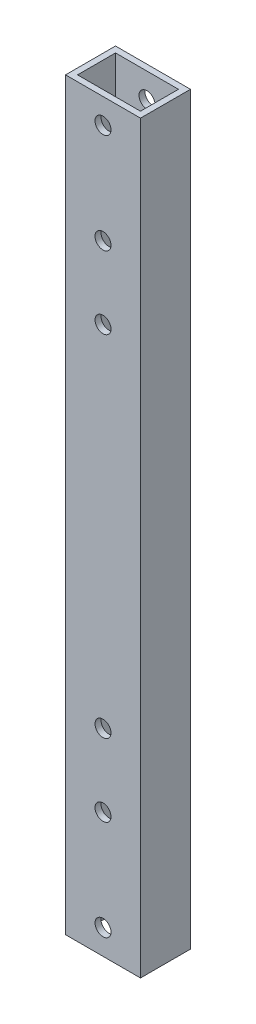
ISO-10303-21;
HEADER;
FILE_DESCRIPTION(('STEP AP214'),'2;1');
FILE_NAME('part.step','',(''),(''),'','','');
FILE_SCHEMA(('AUTOMOTIVE_DESIGN { 1 0 10303 214 1 1 1 1 }'));
ENDSEC;
DATA;
#1=APPLICATION_CONTEXT('core data for automotive mechanical design processes');
#2=APPLICATION_PROTOCOL_DEFINITION('international standard','automotive_design',2000,#1);
#3=PRODUCT_CONTEXT('',#1,'mechanical');
#4=PRODUCT('Part','Part','',(#3));
#5=PRODUCT_RELATED_PRODUCT_CATEGORY('part','',(#4));
#6=PRODUCT_DEFINITION_FORMATION('','',#4);
#7=PRODUCT_DEFINITION_CONTEXT('part definition',#1,'design');
#8=PRODUCT_DEFINITION('design','',#6,#7);
#9=PRODUCT_DEFINITION_SHAPE('','',#8);
#10=(LENGTH_UNIT() NAMED_UNIT(*) SI_UNIT(.MILLI.,.METRE.));
#11=(NAMED_UNIT(*) PLANE_ANGLE_UNIT() SI_UNIT($,.RADIAN.));
#12=(NAMED_UNIT(*) SI_UNIT($,.STERADIAN.) SOLID_ANGLE_UNIT());
#13=UNCERTAINTY_MEASURE_WITH_UNIT(LENGTH_MEASURE(1.E-05),#10,'distance_accuracy_value','');
#14=(GEOMETRIC_REPRESENTATION_CONTEXT(3) GLOBAL_UNCERTAINTY_ASSIGNED_CONTEXT((#13)) GLOBAL_UNIT_ASSIGNED_CONTEXT((#10,
#11,#12)) REPRESENTATION_CONTEXT('',''));
#15=CARTESIAN_POINT('',(0.,0.,0.));
#16=DIRECTION('',(0.,0.,1.));
#17=DIRECTION('',(1.,0.,0.));
#18=AXIS2_PLACEMENT_3D('',#15,#16,#17);
#19=CARTESIAN_POINT('',(0.,74.51,0.));
#20=DIRECTION('',(0.,1.,0.));
#21=DIRECTION('',(0.,0.,1.));
#22=AXIS2_PLACEMENT_3D('',#19,#20,#21);
#23=PLANE('',#22);
#24=DIRECTION('',(0.,0.,-1.));
#25=VECTOR('',#24,1.);
#26=CARTESIAN_POINT('',(7.5,74.51,-5.));
#27=LINE('',#26,#25);
#28=CARTESIAN_POINT('',(7.5,74.51,5.));
#29=VERTEX_POINT('',#28);
#30=CARTESIAN_POINT('',(7.5,74.51,-5.));
#31=VERTEX_POINT('',#30);
#32=EDGE_CURVE('E163',#29,#31,#27,.T.);
#33=ORIENTED_EDGE('',*,*,#32,.T.);
#34=DIRECTION('',(-1.,0.,0.));
#35=VECTOR('',#34,1.);
#36=CARTESIAN_POINT('',(-7.5,74.51,-5.));
#37=LINE('',#36,#35);
#38=CARTESIAN_POINT('',(-7.5,74.51,-5.));
#39=VERTEX_POINT('',#38);
#40=EDGE_CURVE('E167',#31,#39,#37,.T.);
#41=ORIENTED_EDGE('',*,*,#40,.T.);
#42=DIRECTION('',(0.,0.,1.));
#43=VECTOR('',#42,1.);
#44=CARTESIAN_POINT('',(-7.5,74.51,-5.));
#45=LINE('',#44,#43);
#46=CARTESIAN_POINT('',(-7.5,74.51,5.));
#47=VERTEX_POINT('',#46);
#48=EDGE_CURVE('E171',#39,#47,#45,.T.);
#49=ORIENTED_EDGE('',*,*,#48,.T.);
#50=DIRECTION('',(1.,0.,0.));
#51=VECTOR('',#50,1.);
#52=CARTESIAN_POINT('',(-7.5,74.51,5.));
#53=LINE('',#52,#51);
#54=EDGE_CURVE('E174',#47,#29,#53,.T.);
#55=ORIENTED_EDGE('',*,*,#54,.T.);
#56=EDGE_LOOP('',(#33,#41,#49,#55));
#57=FACE_BOUND('',#56,.T.);
#58=DIRECTION('',(1.,0.,0.));
#59=VECTOR('',#58,1.);
#60=CARTESIAN_POINT('',(-6.3,74.51,3.8));
#61=LINE('',#60,#59);
#62=CARTESIAN_POINT('',(-6.3,74.51,3.8));
#63=VERTEX_POINT('',#62);
#64=CARTESIAN_POINT('',(6.3,74.51,3.8));
#65=VERTEX_POINT('',#64);
#66=EDGE_CURVE('E122',#63,#65,#61,.T.);
#67=ORIENTED_EDGE('',*,*,#66,.F.);
#68=DIRECTION('',(0.,0.,1.));
#69=VECTOR('',#68,1.);
#70=CARTESIAN_POINT('',(-6.3,74.51,-3.8));
#71=LINE('',#70,#69);
#72=CARTESIAN_POINT('',(-6.3,74.51,-3.8));
#73=VERTEX_POINT('',#72);
#74=EDGE_CURVE('E113',#73,#63,#71,.T.);
#75=ORIENTED_EDGE('',*,*,#74,.F.);
#76=DIRECTION('',(-1.,0.,0.));
#77=VECTOR('',#76,1.);
#78=CARTESIAN_POINT('',(-6.3,74.51,-3.8));
#79=LINE('',#78,#77);
#80=CARTESIAN_POINT('',(6.3,74.51,-3.8));
#81=VERTEX_POINT('',#80);
#82=EDGE_CURVE('E139',#81,#73,#79,.T.);
#83=ORIENTED_EDGE('',*,*,#82,.F.);
#84=DIRECTION('',(0.,0.,-1.));
#85=VECTOR('',#84,1.);
#86=CARTESIAN_POINT('',(6.3,74.51,-3.8));
#87=LINE('',#86,#85);
#88=EDGE_CURVE('E135',#65,#81,#87,.T.);
#89=ORIENTED_EDGE('',*,*,#88,.F.);
#90=EDGE_LOOP('',(#67,#75,#83,#89));
#91=FACE_BOUND('',#90,.T.);
#92=ADVANCED_FACE('F45',(#57,#91),#23,.T.);
#93=CARTESIAN_POINT('',(0.,-74.51,0.));
#94=DIRECTION('',(0.,1.,0.));
#95=DIRECTION('',(0.,0.,1.));
#96=AXIS2_PLACEMENT_3D('',#93,#94,#95);
#97=PLANE('',#96);
#98=DIRECTION('',(0.,0.,-1.));
#99=VECTOR('',#98,1.);
#100=CARTESIAN_POINT('',(7.5,-74.51,-5.));
#101=LINE('',#100,#99);
#102=CARTESIAN_POINT('',(7.5,-74.51,5.));
#103=VERTEX_POINT('',#102);
#104=CARTESIAN_POINT('',(7.5,-74.51,-5.));
#105=VERTEX_POINT('',#104);
#106=EDGE_CURVE('E131',#103,#105,#101,.T.);
#107=ORIENTED_EDGE('',*,*,#106,.F.);
#108=DIRECTION('',(1.,0.,0.));
#109=VECTOR('',#108,1.);
#110=CARTESIAN_POINT('',(-7.5,-74.51,5.));
#111=LINE('',#110,#109);
#112=CARTESIAN_POINT('',(-7.5,-74.51,5.));
#113=VERTEX_POINT('',#112);
#114=EDGE_CURVE('E168',#113,#103,#111,.T.);
#115=ORIENTED_EDGE('',*,*,#114,.F.);
#116=DIRECTION('',(0.,0.,1.));
#117=VECTOR('',#116,1.);
#118=CARTESIAN_POINT('',(-7.5,-74.51,-5.));
#119=LINE('',#118,#117);
#120=CARTESIAN_POINT('',(-7.5,-74.51,-5.));
#121=VERTEX_POINT('',#120);
#122=EDGE_CURVE('E184',#121,#113,#119,.T.);
#123=ORIENTED_EDGE('',*,*,#122,.F.);
#124=DIRECTION('',(-1.,0.,0.));
#125=VECTOR('',#124,1.);
#126=CARTESIAN_POINT('',(-7.5,-74.51,-5.));
#127=LINE('',#126,#125);
#128=EDGE_CURVE('E181',#105,#121,#127,.T.);
#129=ORIENTED_EDGE('',*,*,#128,.F.);
#130=EDGE_LOOP('',(#107,#115,#123,#129));
#131=FACE_BOUND('',#130,.T.);
#132=DIRECTION('',(0.,0.,1.));
#133=VECTOR('',#132,1.);
#134=CARTESIAN_POINT('',(-6.3,-74.51,-3.8));
#135=LINE('',#134,#133);
#136=CARTESIAN_POINT('',(-6.3,-74.51,-3.8));
#137=VERTEX_POINT('',#136);
#138=CARTESIAN_POINT('',(-6.3,-74.51,3.8));
#139=VERTEX_POINT('',#138);
#140=EDGE_CURVE('E71',#137,#139,#135,.T.);
#141=ORIENTED_EDGE('',*,*,#140,.T.);
#142=DIRECTION('',(1.,0.,0.));
#143=VECTOR('',#142,1.);
#144=CARTESIAN_POINT('',(-6.3,-74.51,3.8));
#145=LINE('',#144,#143);
#146=CARTESIAN_POINT('',(6.3,-74.51,3.8));
#147=VERTEX_POINT('',#146);
#148=EDGE_CURVE('E129',#139,#147,#145,.T.);
#149=ORIENTED_EDGE('',*,*,#148,.T.);
#150=DIRECTION('',(0.,0.,-1.));
#151=VECTOR('',#150,1.);
#152=CARTESIAN_POINT('',(6.3,-74.51,-3.8));
#153=LINE('',#152,#151);
#154=CARTESIAN_POINT('',(6.3,-74.51,-3.8));
#155=VERTEX_POINT('',#154);
#156=EDGE_CURVE('E150',#147,#155,#153,.T.);
#157=ORIENTED_EDGE('',*,*,#156,.T.);
#158=DIRECTION('',(-1.,0.,0.));
#159=VECTOR('',#158,1.);
#160=CARTESIAN_POINT('',(-6.3,-74.51,-3.8));
#161=LINE('',#160,#159);
#162=EDGE_CURVE('E123',#155,#137,#161,.T.);
#163=ORIENTED_EDGE('',*,*,#162,.T.);
#164=EDGE_LOOP('',(#141,#149,#157,#163));
#165=FACE_BOUND('',#164,.T.);
#166=ADVANCED_FACE('F310',(#131,#165),#97,.F.);
#167=CARTESIAN_POINT('',(7.5,74.51,-5.));
#168=DIRECTION('',(-1.,0.,0.));
#169=DIRECTION('',(0.,0.,1.));
#170=AXIS2_PLACEMENT_3D('',#167,#168,#169);
#171=PLANE('',#170);
#172=ORIENTED_EDGE('',*,*,#106,.T.);
#173=DIRECTION('',(0.,-1.,0.));
#174=VECTOR('',#173,1.);
#175=CARTESIAN_POINT('',(7.5,74.51,-5.));
#176=LINE('',#175,#174);
#177=EDGE_CURVE('E11',#31,#105,#176,.T.);
#178=ORIENTED_EDGE('',*,*,#177,.F.);
#179=ORIENTED_EDGE('',*,*,#32,.F.);
#180=DIRECTION('',(0.,-1.,0.));
#181=VECTOR('',#180,1.);
#182=CARTESIAN_POINT('',(7.5,74.51,5.));
#183=LINE('',#182,#181);
#184=EDGE_CURVE('E177',#29,#103,#183,.T.);
#185=ORIENTED_EDGE('',*,*,#184,.T.);
#186=EDGE_LOOP('',(#172,#178,#179,#185));
#187=FACE_BOUND('',#186,.T.);
#188=ADVANCED_FACE('F47',(#187),#171,.F.);
#189=CARTESIAN_POINT('',(-7.5,74.51,-5.));
#190=DIRECTION('',(0.,0.,1.));
#191=DIRECTION('',(1.,0.,0.));
#192=AXIS2_PLACEMENT_3D('',#189,#190,#191);
#193=PLANE('',#192);
#194=CARTESIAN_POINT('',(0.,-35.,-5.));
#195=DIRECTION('',(0.,0.,-1.));
#196=DIRECTION('',(1.,0.,0.));
#197=AXIS2_PLACEMENT_3D('',#194,#195,#196);
#198=CIRCLE('',#197,1.6);
#199=CARTESIAN_POINT('',(1.6,-35.,-5.));
#200=VERTEX_POINT('',#199);
#201=EDGE_CURVE('E383',#200,#200,#198,.T.);
#202=ORIENTED_EDGE('',*,*,#201,.F.);
#203=EDGE_LOOP('',(#202));
#204=FACE_BOUND('',#203,.T.);
#205=CARTESIAN_POINT('',(0.,-69.51,-5.));
#206=DIRECTION('',(0.,0.,-1.));
#207=DIRECTION('',(1.,0.,0.));
#208=AXIS2_PLACEMENT_3D('',#205,#206,#207);
#209=CIRCLE('',#208,1.6);
#210=CARTESIAN_POINT('',(1.6,-69.51,-5.));
#211=VERTEX_POINT('',#210);
#212=EDGE_CURVE('E382',#211,#211,#209,.T.);
#213=ORIENTED_EDGE('',*,*,#212,.F.);
#214=EDGE_LOOP('',(#213));
#215=FACE_BOUND('',#214,.T.);
#216=CARTESIAN_POINT('',(0.,-49.51,-5.));
#217=DIRECTION('',(0.,0.,-1.));
#218=DIRECTION('',(1.,0.,0.));
#219=AXIS2_PLACEMENT_3D('',#216,#217,#218);
#220=CIRCLE('',#219,1.6);
#221=CARTESIAN_POINT('',(1.6,-49.51,-5.));
#222=VERTEX_POINT('',#221);
#223=EDGE_CURVE('E218',#222,#222,#220,.T.);
#224=ORIENTED_EDGE('',*,*,#223,.F.);
#225=EDGE_LOOP('',(#224));
#226=FACE_BOUND('',#225,.T.);
#227=CARTESIAN_POINT('',(0.,35.,-5.));
#228=DIRECTION('',(0.,0.,1.));
#229=DIRECTION('',(1.,0.,0.));
#230=AXIS2_PLACEMENT_3D('',#227,#228,#229);
#231=CIRCLE('',#230,1.6);
#232=CARTESIAN_POINT('',(1.6,35.,-5.));
#233=VERTEX_POINT('',#232);
#234=EDGE_CURVE('E251',#233,#233,#231,.T.);
#235=ORIENTED_EDGE('',*,*,#234,.T.);
#236=EDGE_LOOP('',(#235));
#237=FACE_BOUND('',#236,.T.);
#238=CARTESIAN_POINT('',(0.,69.51,-5.));
#239=DIRECTION('',(0.,0.,1.));
#240=DIRECTION('',(1.,0.,0.));
#241=AXIS2_PLACEMENT_3D('',#238,#239,#240);
#242=CIRCLE('',#241,1.6);
#243=CARTESIAN_POINT('',(1.6,69.51,-5.));
#244=VERTEX_POINT('',#243);
#245=EDGE_CURVE('E242',#244,#244,#242,.T.);
#246=ORIENTED_EDGE('',*,*,#245,.T.);
#247=EDGE_LOOP('',(#246));
#248=FACE_BOUND('',#247,.T.);
#249=CARTESIAN_POINT('',(0.,49.51,-5.));
#250=DIRECTION('',(0.,0.,1.));
#251=DIRECTION('',(1.,0.,0.));
#252=AXIS2_PLACEMENT_3D('',#249,#250,#251);
#253=CIRCLE('',#252,1.6);
#254=CARTESIAN_POINT('',(1.6,49.51,-5.));
#255=VERTEX_POINT('',#254);
#256=EDGE_CURVE('E204',#255,#255,#253,.T.);
#257=ORIENTED_EDGE('',*,*,#256,.T.);
#258=EDGE_LOOP('',(#257));
#259=FACE_BOUND('',#258,.T.);
#260=ORIENTED_EDGE('',*,*,#128,.T.);
#261=DIRECTION('',(0.,-1.,0.));
#262=VECTOR('',#261,1.);
#263=CARTESIAN_POINT('',(-7.5,74.51,-5.));
#264=LINE('',#263,#262);
#265=EDGE_CURVE('E55',#39,#121,#264,.T.);
#266=ORIENTED_EDGE('',*,*,#265,.F.);
#267=ORIENTED_EDGE('',*,*,#40,.F.);
#268=ORIENTED_EDGE('',*,*,#177,.T.);
#269=EDGE_LOOP('',(#260,#266,#267,#268));
#270=FACE_BOUND('',#269,.T.);
#271=ADVANCED_FACE('F314',(#204,#215,#226,#237,#248,#259,#270),#193,.F.);
#272=CARTESIAN_POINT('',(-7.5,74.51,-5.));
#273=DIRECTION('',(1.,0.,0.));
#274=DIRECTION('',(0.,0.,-1.));
#275=AXIS2_PLACEMENT_3D('',#272,#273,#274);
#276=PLANE('',#275);
#277=ORIENTED_EDGE('',*,*,#122,.T.);
#278=DIRECTION('',(0.,-1.,0.));
#279=VECTOR('',#278,1.);
#280=CARTESIAN_POINT('',(-7.5,74.51,5.));
#281=LINE('',#280,#279);
#282=EDGE_CURVE('E192',#47,#113,#281,.T.);
#283=ORIENTED_EDGE('',*,*,#282,.F.);
#284=ORIENTED_EDGE('',*,*,#48,.F.);
#285=ORIENTED_EDGE('',*,*,#265,.T.);
#286=EDGE_LOOP('',(#277,#283,#284,#285));
#287=FACE_BOUND('',#286,.T.);
#288=ADVANCED_FACE('F297',(#287),#276,.F.);
#289=CARTESIAN_POINT('',(-7.5,74.51,5.));
#290=DIRECTION('',(0.,0.,-1.));
#291=DIRECTION('',(-1.,0.,0.));
#292=AXIS2_PLACEMENT_3D('',#289,#290,#291);
#293=PLANE('',#292);
#294=CARTESIAN_POINT('',(0.,-35.,5.));
#295=DIRECTION('',(0.,0.,-1.));
#296=DIRECTION('',(1.,0.,0.));
#297=AXIS2_PLACEMENT_3D('',#294,#295,#296);
#298=CIRCLE('',#297,1.6);
#299=CARTESIAN_POINT('',(1.6,-35.,5.));
#300=VERTEX_POINT('',#299);
#301=EDGE_CURVE('E390',#300,#300,#298,.T.);
#302=ORIENTED_EDGE('',*,*,#301,.T.);
#303=EDGE_LOOP('',(#302));
#304=FACE_BOUND('',#303,.T.);
#305=CARTESIAN_POINT('',(0.,-69.51,5.));
#306=DIRECTION('',(0.,0.,-1.));
#307=DIRECTION('',(1.,0.,0.));
#308=AXIS2_PLACEMENT_3D('',#305,#306,#307);
#309=CIRCLE('',#308,1.6);
#310=CARTESIAN_POINT('',(1.6,-69.51,5.));
#311=VERTEX_POINT('',#310);
#312=EDGE_CURVE('E379',#311,#311,#309,.T.);
#313=ORIENTED_EDGE('',*,*,#312,.T.);
#314=EDGE_LOOP('',(#313));
#315=FACE_BOUND('',#314,.T.);
#316=CARTESIAN_POINT('',(0.,-49.51,5.));
#317=DIRECTION('',(0.,0.,-1.));
#318=DIRECTION('',(1.,0.,0.));
#319=AXIS2_PLACEMENT_3D('',#316,#317,#318);
#320=CIRCLE('',#319,1.6);
#321=CARTESIAN_POINT('',(1.6,-49.51,5.));
#322=VERTEX_POINT('',#321);
#323=EDGE_CURVE('E234',#322,#322,#320,.T.);
#324=ORIENTED_EDGE('',*,*,#323,.T.);
#325=EDGE_LOOP('',(#324));
#326=FACE_BOUND('',#325,.T.);
#327=CARTESIAN_POINT('',(0.,35.,5.));
#328=DIRECTION('',(0.,0.,1.));
#329=DIRECTION('',(1.,0.,0.));
#330=AXIS2_PLACEMENT_3D('',#327,#328,#329);
#331=CIRCLE('',#330,1.6);
#332=CARTESIAN_POINT('',(1.6,35.,5.));
#333=VERTEX_POINT('',#332);
#334=EDGE_CURVE('E241',#333,#333,#331,.T.);
#335=ORIENTED_EDGE('',*,*,#334,.F.);
#336=EDGE_LOOP('',(#335));
#337=FACE_BOUND('',#336,.T.);
#338=CARTESIAN_POINT('',(0.,69.51,5.));
#339=DIRECTION('',(0.,0.,1.));
#340=DIRECTION('',(1.,0.,0.));
#341=AXIS2_PLACEMENT_3D('',#338,#339,#340);
#342=CIRCLE('',#341,1.6);
#343=CARTESIAN_POINT('',(1.6,69.51,5.));
#344=VERTEX_POINT('',#343);
#345=EDGE_CURVE('E247',#344,#344,#342,.T.);
#346=ORIENTED_EDGE('',*,*,#345,.F.);
#347=EDGE_LOOP('',(#346));
#348=FACE_BOUND('',#347,.T.);
#349=CARTESIAN_POINT('',(0.,49.51,5.));
#350=DIRECTION('',(0.,0.,1.));
#351=DIRECTION('',(1.,0.,0.));
#352=AXIS2_PLACEMENT_3D('',#349,#350,#351);
#353=CIRCLE('',#352,1.6);
#354=CARTESIAN_POINT('',(1.6,49.51,5.));
#355=VERTEX_POINT('',#354);
#356=EDGE_CURVE('E246',#355,#355,#353,.T.);
#357=ORIENTED_EDGE('',*,*,#356,.F.);
#358=EDGE_LOOP('',(#357));
#359=FACE_BOUND('',#358,.T.);
#360=ORIENTED_EDGE('',*,*,#114,.T.);
#361=ORIENTED_EDGE('',*,*,#184,.F.);
#362=ORIENTED_EDGE('',*,*,#54,.F.);
#363=ORIENTED_EDGE('',*,*,#282,.T.);
#364=EDGE_LOOP('',(#360,#361,#362,#363));
#365=FACE_BOUND('',#364,.T.);
#366=ADVANCED_FACE('F294',(#304,#315,#326,#337,#348,#359,#365),#293,.F.);
#367=CARTESIAN_POINT('',(-6.3,74.51,-3.8));
#368=DIRECTION('',(1.,0.,0.));
#369=DIRECTION('',(0.,0.,-1.));
#370=AXIS2_PLACEMENT_3D('',#367,#368,#369);
#371=PLANE('',#370);
#372=ORIENTED_EDGE('',*,*,#140,.F.);
#373=DIRECTION('',(0.,-1.,0.));
#374=VECTOR('',#373,1.);
#375=CARTESIAN_POINT('',(-6.3,74.51,-3.8));
#376=LINE('',#375,#374);
#377=EDGE_CURVE('E117',#73,#137,#376,.T.);
#378=ORIENTED_EDGE('',*,*,#377,.F.);
#379=ORIENTED_EDGE('',*,*,#74,.T.);
#380=DIRECTION('',(0.,-1.,0.));
#381=VECTOR('',#380,1.);
#382=CARTESIAN_POINT('',(-6.3,74.51,3.8));
#383=LINE('',#382,#381);
#384=EDGE_CURVE('E116',#63,#139,#383,.T.);
#385=ORIENTED_EDGE('',*,*,#384,.T.);
#386=EDGE_LOOP('',(#372,#378,#379,#385));
#387=FACE_BOUND('',#386,.T.);
#388=ADVANCED_FACE('F115',(#387),#371,.T.);
#389=CARTESIAN_POINT('',(-6.3,74.51,3.8));
#390=DIRECTION('',(0.,0.,-1.));
#391=DIRECTION('',(-1.,0.,0.));
#392=AXIS2_PLACEMENT_3D('',#389,#390,#391);
#393=PLANE('',#392);
#394=CARTESIAN_POINT('',(0.,-35.,3.8));
#395=DIRECTION('',(0.,0.,-1.));
#396=DIRECTION('',(-1.,0.,0.));
#397=AXIS2_PLACEMENT_3D('',#394,#395,#396);
#398=CIRCLE('',#397,1.6);
#399=CARTESIAN_POINT('',(-1.6,-35.,3.8));
#400=VERTEX_POINT('',#399);
#401=EDGE_CURVE('E237',#400,#400,#398,.F.);
#402=ORIENTED_EDGE('',*,*,#401,.T.);
#403=EDGE_LOOP('',(#402));
#404=FACE_BOUND('',#403,.T.);
#405=CARTESIAN_POINT('',(0.,-69.51,3.8));
#406=DIRECTION('',(0.,0.,-1.));
#407=DIRECTION('',(-1.,0.,0.));
#408=AXIS2_PLACEMENT_3D('',#405,#406,#407);
#409=CIRCLE('',#408,1.6);
#410=CARTESIAN_POINT('',(-1.6,-69.51,3.8));
#411=VERTEX_POINT('',#410);
#412=EDGE_CURVE('E222',#411,#411,#409,.F.);
#413=ORIENTED_EDGE('',*,*,#412,.T.);
#414=EDGE_LOOP('',(#413));
#415=FACE_BOUND('',#414,.T.);
#416=CARTESIAN_POINT('',(0.,-49.51,3.8));
#417=DIRECTION('',(0.,0.,-1.));
#418=DIRECTION('',(-1.,0.,0.));
#419=AXIS2_PLACEMENT_3D('',#416,#417,#418);
#420=CIRCLE('',#419,1.6);
#421=CARTESIAN_POINT('',(-1.6,-49.51,3.8));
#422=VERTEX_POINT('',#421);
#423=EDGE_CURVE('E217',#422,#422,#420,.F.);
#424=ORIENTED_EDGE('',*,*,#423,.T.);
#425=EDGE_LOOP('',(#424));
#426=FACE_BOUND('',#425,.T.);
#427=CARTESIAN_POINT('',(0.,35.,3.8));
#428=DIRECTION('',(0.,0.,-1.));
#429=DIRECTION('',(-1.,0.,0.));
#430=AXIS2_PLACEMENT_3D('',#427,#428,#429);
#431=CIRCLE('',#430,1.6);
#432=CARTESIAN_POINT('',(-1.6,35.,3.8));
#433=VERTEX_POINT('',#432);
#434=EDGE_CURVE('E147',#433,#433,#431,.T.);
#435=ORIENTED_EDGE('',*,*,#434,.F.);
#436=EDGE_LOOP('',(#435));
#437=FACE_BOUND('',#436,.T.);
#438=CARTESIAN_POINT('',(0.,69.51,3.8));
#439=DIRECTION('',(0.,0.,-1.));
#440=DIRECTION('',(-1.,0.,0.));
#441=AXIS2_PLACEMENT_3D('',#438,#439,#440);
#442=CIRCLE('',#441,1.6);
#443=CARTESIAN_POINT('',(-1.6,69.51,3.8));
#444=VERTEX_POINT('',#443);
#445=EDGE_CURVE('E209',#444,#444,#442,.T.);
#446=ORIENTED_EDGE('',*,*,#445,.F.);
#447=EDGE_LOOP('',(#446));
#448=FACE_BOUND('',#447,.T.);
#449=CARTESIAN_POINT('',(0.,49.51,3.8));
#450=DIRECTION('',(0.,0.,-1.));
#451=DIRECTION('',(-1.,0.,0.));
#452=AXIS2_PLACEMENT_3D('',#449,#450,#451);
#453=CIRCLE('',#452,1.6);
#454=CARTESIAN_POINT('',(-1.6,49.51,3.8));
#455=VERTEX_POINT('',#454);
#456=EDGE_CURVE('E203',#455,#455,#453,.T.);
#457=ORIENTED_EDGE('',*,*,#456,.F.);
#458=EDGE_LOOP('',(#457));
#459=FACE_BOUND('',#458,.T.);
#460=ORIENTED_EDGE('',*,*,#148,.F.);
#461=ORIENTED_EDGE('',*,*,#384,.F.);
#462=ORIENTED_EDGE('',*,*,#66,.T.);
#463=DIRECTION('',(0.,-1.,0.));
#464=VECTOR('',#463,1.);
#465=CARTESIAN_POINT('',(6.3,74.51,3.8));
#466=LINE('',#465,#464);
#467=EDGE_CURVE('E132',#65,#147,#466,.T.);
#468=ORIENTED_EDGE('',*,*,#467,.T.);
#469=EDGE_LOOP('',(#460,#461,#462,#468));
#470=FACE_BOUND('',#469,.T.);
#471=ADVANCED_FACE('F126',(#404,#415,#426,#437,#448,#459,#470),#393,.T.);
#472=CARTESIAN_POINT('',(6.3,74.51,-3.8));
#473=DIRECTION('',(-1.,0.,0.));
#474=DIRECTION('',(0.,0.,1.));
#475=AXIS2_PLACEMENT_3D('',#472,#473,#474);
#476=PLANE('',#475);
#477=ORIENTED_EDGE('',*,*,#156,.F.);
#478=ORIENTED_EDGE('',*,*,#467,.F.);
#479=ORIENTED_EDGE('',*,*,#88,.T.);
#480=DIRECTION('',(0.,-1.,0.));
#481=VECTOR('',#480,1.);
#482=CARTESIAN_POINT('',(6.3,74.51,-3.8));
#483=LINE('',#482,#481);
#484=EDGE_CURVE('E63',#81,#155,#483,.T.);
#485=ORIENTED_EDGE('',*,*,#484,.T.);
#486=EDGE_LOOP('',(#477,#478,#479,#485));
#487=FACE_BOUND('',#486,.T.);
#488=ADVANCED_FACE('F278',(#487),#476,.T.);
#489=CARTESIAN_POINT('',(-6.3,74.51,-3.8));
#490=DIRECTION('',(0.,0.,1.));
#491=DIRECTION('',(1.,0.,0.));
#492=AXIS2_PLACEMENT_3D('',#489,#490,#491);
#493=PLANE('',#492);
#494=CARTESIAN_POINT('',(0.,-35.,-3.8));
#495=DIRECTION('',(0.,0.,1.));
#496=DIRECTION('',(1.,0.,0.));
#497=AXIS2_PLACEMENT_3D('',#494,#495,#496);
#498=CIRCLE('',#497,1.6);
#499=CARTESIAN_POINT('',(1.6,-35.,-3.8));
#500=VERTEX_POINT('',#499);
#501=EDGE_CURVE('E49',#500,#500,#498,.F.);
#502=ORIENTED_EDGE('',*,*,#501,.T.);
#503=EDGE_LOOP('',(#502));
#504=FACE_BOUND('',#503,.T.);
#505=CARTESIAN_POINT('',(0.,-69.51,-3.8));
#506=DIRECTION('',(0.,0.,1.));
#507=DIRECTION('',(1.,0.,0.));
#508=AXIS2_PLACEMENT_3D('',#505,#506,#507);
#509=CIRCLE('',#508,1.6);
#510=CARTESIAN_POINT('',(1.6,-69.51,-3.8));
#511=VERTEX_POINT('',#510);
#512=EDGE_CURVE('E219',#511,#511,#509,.F.);
#513=ORIENTED_EDGE('',*,*,#512,.T.);
#514=EDGE_LOOP('',(#513));
#515=FACE_BOUND('',#514,.T.);
#516=CARTESIAN_POINT('',(0.,-49.51,-3.8));
#517=DIRECTION('',(0.,0.,1.));
#518=DIRECTION('',(1.,0.,0.));
#519=AXIS2_PLACEMENT_3D('',#516,#517,#518);
#520=CIRCLE('',#519,1.6);
#521=CARTESIAN_POINT('',(1.6,-49.51,-3.8));
#522=VERTEX_POINT('',#521);
#523=EDGE_CURVE('E214',#522,#522,#520,.F.);
#524=ORIENTED_EDGE('',*,*,#523,.T.);
#525=EDGE_LOOP('',(#524));
#526=FACE_BOUND('',#525,.T.);
#527=CARTESIAN_POINT('',(0.,35.,-3.8));
#528=DIRECTION('',(0.,0.,1.));
#529=DIRECTION('',(1.,0.,0.));
#530=AXIS2_PLACEMENT_3D('',#527,#528,#529);
#531=CIRCLE('',#530,1.6);
#532=CARTESIAN_POINT('',(1.6,35.,-3.8));
#533=VERTEX_POINT('',#532);
#534=EDGE_CURVE('E210',#533,#533,#531,.T.);
#535=ORIENTED_EDGE('',*,*,#534,.F.);
#536=EDGE_LOOP('',(#535));
#537=FACE_BOUND('',#536,.T.);
#538=CARTESIAN_POINT('',(0.,69.51,-3.8));
#539=DIRECTION('',(0.,0.,1.));
#540=DIRECTION('',(1.,0.,0.));
#541=AXIS2_PLACEMENT_3D('',#538,#539,#540);
#542=CIRCLE('',#541,1.6);
#543=CARTESIAN_POINT('',(1.6,69.51,-3.8));
#544=VERTEX_POINT('',#543);
#545=EDGE_CURVE('E205',#544,#544,#542,.T.);
#546=ORIENTED_EDGE('',*,*,#545,.F.);
#547=EDGE_LOOP('',(#546));
#548=FACE_BOUND('',#547,.T.);
#549=CARTESIAN_POINT('',(0.,49.51,-3.8));
#550=DIRECTION('',(0.,0.,1.));
#551=DIRECTION('',(1.,0.,0.));
#552=AXIS2_PLACEMENT_3D('',#549,#550,#551);
#553=CIRCLE('',#552,1.6);
#554=CARTESIAN_POINT('',(1.6,49.51,-3.8));
#555=VERTEX_POINT('',#554);
#556=EDGE_CURVE('E199',#555,#555,#553,.T.);
#557=ORIENTED_EDGE('',*,*,#556,.F.);
#558=EDGE_LOOP('',(#557));
#559=FACE_BOUND('',#558,.T.);
#560=ORIENTED_EDGE('',*,*,#162,.F.);
#561=ORIENTED_EDGE('',*,*,#484,.F.);
#562=ORIENTED_EDGE('',*,*,#82,.T.);
#563=ORIENTED_EDGE('',*,*,#377,.T.);
#564=EDGE_LOOP('',(#560,#561,#562,#563));
#565=FACE_BOUND('',#564,.T.);
#566=ADVANCED_FACE('F336',(#504,#515,#526,#537,#548,#559,#565),#493,.T.);
#567=CARTESIAN_POINT('',(0.,49.51,-5.));
#568=DIRECTION('',(0.,0.,1.));
#569=DIRECTION('',(1.,0.,0.));
#570=AXIS2_PLACEMENT_3D('',#567,#568,#569);
#571=CYLINDRICAL_SURFACE('',#570,1.6);
#572=ORIENTED_EDGE('',*,*,#556,.T.);
#573=EDGE_LOOP('',(#572));
#574=FACE_BOUND('',#573,.T.);
#575=ORIENTED_EDGE('',*,*,#256,.F.);
#576=EDGE_LOOP('',(#575));
#577=FACE_BOUND('',#576,.T.);
#578=ADVANCED_FACE('F291',(#574,#577),#571,.F.);
#579=CARTESIAN_POINT('',(0.,69.51,-5.));
#580=DIRECTION('',(0.,0.,1.));
#581=DIRECTION('',(1.,0.,0.));
#582=AXIS2_PLACEMENT_3D('',#579,#580,#581);
#583=CYLINDRICAL_SURFACE('',#582,1.6);
#584=ORIENTED_EDGE('',*,*,#545,.T.);
#585=EDGE_LOOP('',(#584));
#586=FACE_BOUND('',#585,.T.);
#587=ORIENTED_EDGE('',*,*,#245,.F.);
#588=EDGE_LOOP('',(#587));
#589=FACE_BOUND('',#588,.T.);
#590=ADVANCED_FACE('F342',(#586,#589),#583,.F.);
#591=CARTESIAN_POINT('',(0.,35.,-5.));
#592=DIRECTION('',(0.,0.,1.));
#593=DIRECTION('',(1.,0.,0.));
#594=AXIS2_PLACEMENT_3D('',#591,#592,#593);
#595=CYLINDRICAL_SURFACE('',#594,1.6);
#596=ORIENTED_EDGE('',*,*,#534,.T.);
#597=EDGE_LOOP('',(#596));
#598=FACE_BOUND('',#597,.T.);
#599=ORIENTED_EDGE('',*,*,#234,.F.);
#600=EDGE_LOOP('',(#599));
#601=FACE_BOUND('',#600,.T.);
#602=ADVANCED_FACE('F289',(#598,#601),#595,.F.);
#603=ORIENTED_EDGE('',*,*,#456,.T.);
#604=EDGE_LOOP('',(#603));
#605=FACE_BOUND('',#604,.T.);
#606=ORIENTED_EDGE('',*,*,#356,.T.);
#607=EDGE_LOOP('',(#606));
#608=FACE_BOUND('',#607,.T.);
#609=ADVANCED_FACE('F285',(#605,#608),#571,.F.);
#610=ORIENTED_EDGE('',*,*,#445,.T.);
#611=EDGE_LOOP('',(#610));
#612=FACE_BOUND('',#611,.T.);
#613=ORIENTED_EDGE('',*,*,#345,.T.);
#614=EDGE_LOOP('',(#613));
#615=FACE_BOUND('',#614,.T.);
#616=ADVANCED_FACE('F288',(#612,#615),#583,.F.);
#617=ORIENTED_EDGE('',*,*,#434,.T.);
#618=EDGE_LOOP('',(#617));
#619=FACE_BOUND('',#618,.T.);
#620=ORIENTED_EDGE('',*,*,#334,.T.);
#621=EDGE_LOOP('',(#620));
#622=FACE_BOUND('',#621,.T.);
#623=ADVANCED_FACE('F273',(#619,#622),#595,.F.);
#624=CARTESIAN_POINT('',(0.,-49.51,-5.));
#625=DIRECTION('',(0.,0.,1.));
#626=DIRECTION('',(1.,0.,0.));
#627=AXIS2_PLACEMENT_3D('',#624,#625,#626);
#628=CYLINDRICAL_SURFACE('',#627,1.6);
#629=ORIENTED_EDGE('',*,*,#523,.F.);
#630=EDGE_LOOP('',(#629));
#631=FACE_BOUND('',#630,.T.);
#632=ORIENTED_EDGE('',*,*,#223,.T.);
#633=EDGE_LOOP('',(#632));
#634=FACE_BOUND('',#633,.T.);
#635=ADVANCED_FACE('F350',(#631,#634),#628,.F.);
#636=CARTESIAN_POINT('',(0.,-69.51,-5.));
#637=DIRECTION('',(0.,0.,1.));
#638=DIRECTION('',(1.,0.,0.));
#639=AXIS2_PLACEMENT_3D('',#636,#637,#638);
#640=CYLINDRICAL_SURFACE('',#639,1.6);
#641=ORIENTED_EDGE('',*,*,#512,.F.);
#642=EDGE_LOOP('',(#641));
#643=FACE_BOUND('',#642,.T.);
#644=ORIENTED_EDGE('',*,*,#212,.T.);
#645=EDGE_LOOP('',(#644));
#646=FACE_BOUND('',#645,.T.);
#647=ADVANCED_FACE('F353',(#643,#646),#640,.F.);
#648=CARTESIAN_POINT('',(0.,-35.,-5.));
#649=DIRECTION('',(0.,0.,1.));
#650=DIRECTION('',(1.,0.,0.));
#651=AXIS2_PLACEMENT_3D('',#648,#649,#650);
#652=CYLINDRICAL_SURFACE('',#651,1.6);
#653=ORIENTED_EDGE('',*,*,#501,.F.);
#654=EDGE_LOOP('',(#653));
#655=FACE_BOUND('',#654,.T.);
#656=ORIENTED_EDGE('',*,*,#201,.T.);
#657=EDGE_LOOP('',(#656));
#658=FACE_BOUND('',#657,.T.);
#659=ADVANCED_FACE('F356',(#655,#658),#652,.F.);
#660=ORIENTED_EDGE('',*,*,#423,.F.);
#661=EDGE_LOOP('',(#660));
#662=FACE_BOUND('',#661,.T.);
#663=ORIENTED_EDGE('',*,*,#323,.F.);
#664=EDGE_LOOP('',(#663));
#665=FACE_BOUND('',#664,.T.);
#666=ADVANCED_FACE('F355',(#662,#665),#628,.F.);
#667=ORIENTED_EDGE('',*,*,#412,.F.);
#668=EDGE_LOOP('',(#667));
#669=FACE_BOUND('',#668,.T.);
#670=ORIENTED_EDGE('',*,*,#312,.F.);
#671=EDGE_LOOP('',(#670));
#672=FACE_BOUND('',#671,.T.);
#673=ADVANCED_FACE('F363',(#669,#672),#640,.F.);
#674=ORIENTED_EDGE('',*,*,#401,.F.);
#675=EDGE_LOOP('',(#674));
#676=FACE_BOUND('',#675,.T.);
#677=ORIENTED_EDGE('',*,*,#301,.F.);
#678=EDGE_LOOP('',(#677));
#679=FACE_BOUND('',#678,.T.);
#680=ADVANCED_FACE('F360',(#676,#679),#652,.F.);
#681=CLOSED_SHELL('',(#92,#166,#188,#271,#288,#366,#388,#471,#488,#566,#578,#590,#602,#609,#616,
#623,#635,#647,#659,#666,#673,#680));
#682=MANIFOLD_SOLID_BREP('B2',#681);
#683=ADVANCED_BREP_SHAPE_REPRESENTATION('',(#18,#682),#14);
#684=SHAPE_DEFINITION_REPRESENTATION(#9,#683);
ENDSEC;
END-ISO-10303-21;
